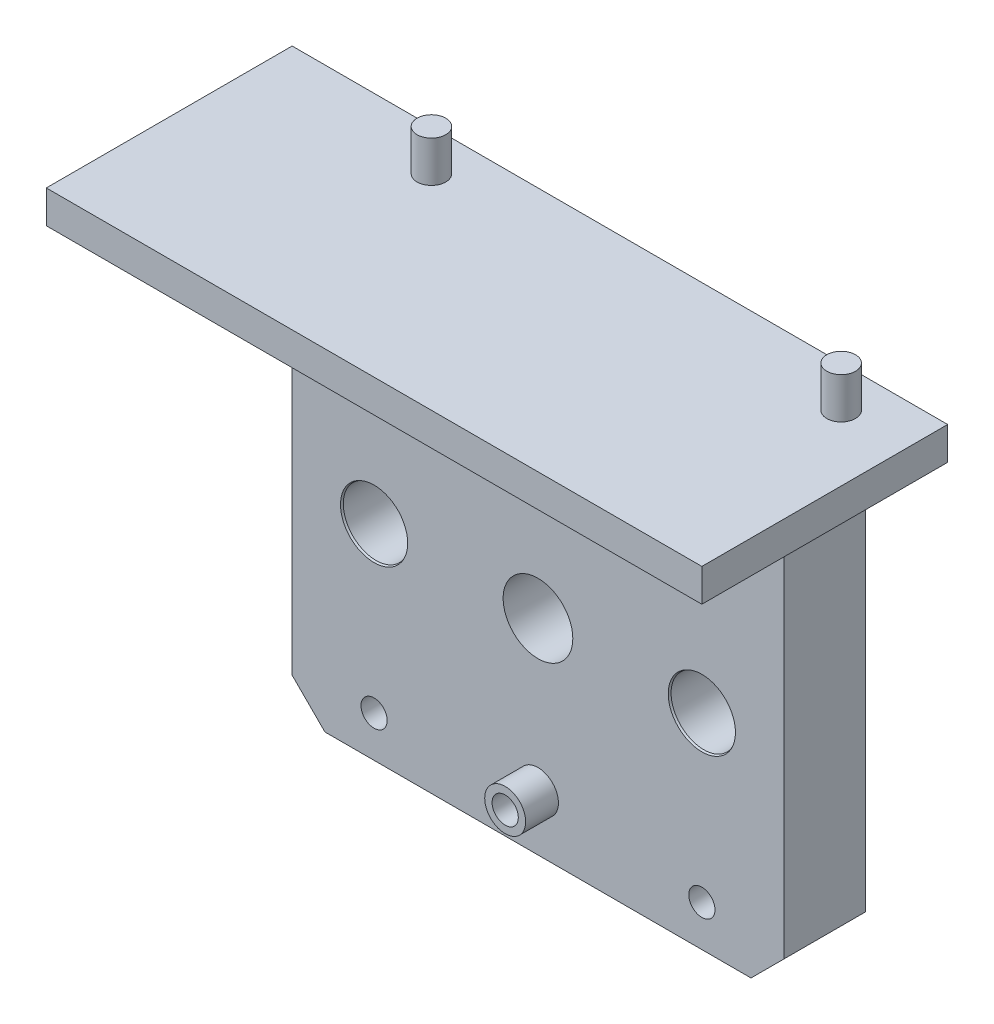
ISO-10303-21;
HEADER;
FILE_DESCRIPTION(('STEP AP214'),'2;1');
FILE_NAME('part.step','',(''),(''),'','','');
FILE_SCHEMA(('AUTOMOTIVE_DESIGN { 1 0 10303 214 1 1 1 1 }'));
ENDSEC;
DATA;
#1=APPLICATION_CONTEXT('core data for automotive mechanical design processes');
#2=APPLICATION_PROTOCOL_DEFINITION('international standard','automotive_design',2000,#1);
#3=PRODUCT_CONTEXT('',#1,'mechanical');
#4=PRODUCT('Part','Part','',(#3));
#5=PRODUCT_RELATED_PRODUCT_CATEGORY('part','',(#4));
#6=PRODUCT_DEFINITION_FORMATION('','',#4);
#7=PRODUCT_DEFINITION_CONTEXT('part definition',#1,'design');
#8=PRODUCT_DEFINITION('design','',#6,#7);
#9=PRODUCT_DEFINITION_SHAPE('','',#8);
#10=(LENGTH_UNIT() NAMED_UNIT(*) SI_UNIT(.MILLI.,.METRE.));
#11=(NAMED_UNIT(*) PLANE_ANGLE_UNIT() SI_UNIT($,.RADIAN.));
#12=(NAMED_UNIT(*) SI_UNIT($,.STERADIAN.) SOLID_ANGLE_UNIT());
#13=UNCERTAINTY_MEASURE_WITH_UNIT(LENGTH_MEASURE(1.E-05),#10,'distance_accuracy_value','');
#14=(GEOMETRIC_REPRESENTATION_CONTEXT(3) GLOBAL_UNCERTAINTY_ASSIGNED_CONTEXT((#13)) GLOBAL_UNIT_ASSIGNED_CONTEXT((#10,
#11,#12)) REPRESENTATION_CONTEXT('',''));
#15=CARTESIAN_POINT('',(0.,0.,0.));
#16=DIRECTION('',(0.,0.,1.));
#17=DIRECTION('',(1.,0.,0.));
#18=AXIS2_PLACEMENT_3D('',#15,#16,#17);
#19=CARTESIAN_POINT('',(0.,0.,10.));
#20=DIRECTION('',(0.,0.,-1.));
#21=DIRECTION('',(-1.,0.,0.));
#22=AXIS2_PLACEMENT_3D('',#19,#20,#21);
#23=PLANE('',#22);
#24=CARTESIAN_POINT('',(20.,-20.0000000000002,10.));
#25=DIRECTION('',(0.,0.,1.));
#26=DIRECTION('',(1.,0.,0.));
#27=AXIS2_PLACEMENT_3D('',#24,#25,#26);
#28=CIRCLE('',#27,1.6);
#29=CARTESIAN_POINT('',(21.6,-20.0000000000002,10.));
#30=VERTEX_POINT('',#29);
#31=EDGE_CURVE('E179',#30,#30,#28,.T.);
#32=ORIENTED_EDGE('',*,*,#31,.F.);
#33=EDGE_LOOP('',(#32));
#34=FACE_BOUND('',#33,.T.);
#35=CARTESIAN_POINT('',(-20.,20.0000000000002,10.));
#36=DIRECTION('',(0.,0.,1.));
#37=DIRECTION('',(1.,0.,0.));
#38=AXIS2_PLACEMENT_3D('',#35,#36,#37);
#39=CIRCLE('',#38,1.6);
#40=CARTESIAN_POINT('',(-18.4,20.0000000000002,10.));
#41=VERTEX_POINT('',#40);
#42=EDGE_CURVE('E175',#41,#41,#39,.T.);
#43=ORIENTED_EDGE('',*,*,#42,.F.);
#44=EDGE_LOOP('',(#43));
#45=FACE_BOUND('',#44,.T.);
#46=CARTESIAN_POINT('',(0.,-18.25,10.));
#47=DIRECTION('',(0.,0.,-1.));
#48=DIRECTION('',(-1.,0.,0.));
#49=AXIS2_PLACEMENT_3D('',#46,#47,#48);
#50=CIRCLE('',#49,2.5);
#51=CARTESIAN_POINT('',(-2.5,-18.25,10.));
#52=VERTEX_POINT('',#51);
#53=EDGE_CURVE('E253',#52,#52,#50,.F.);
#54=ORIENTED_EDGE('',*,*,#53,.F.);
#55=EDGE_LOOP('',(#54));
#56=FACE_BOUND('',#55,.T.);
#57=CARTESIAN_POINT('',(0.,18.25,10.));
#58=DIRECTION('',(0.,0.,-1.));
#59=DIRECTION('',(-1.,0.,0.));
#60=AXIS2_PLACEMENT_3D('',#57,#58,#59);
#61=CIRCLE('',#60,2.5);
#62=CARTESIAN_POINT('',(-2.5,18.25,10.));
#63=VERTEX_POINT('',#62);
#64=EDGE_CURVE('E245',#63,#63,#61,.F.);
#65=ORIENTED_EDGE('',*,*,#64,.F.);
#66=EDGE_LOOP('',(#65));
#67=FACE_BOUND('',#66,.T.);
#68=CARTESIAN_POINT('',(20.,0.,10.));
#69=DIRECTION('',(0.,0.,1.));
#70=DIRECTION('',(1.,0.,0.));
#71=AXIS2_PLACEMENT_3D('',#68,#69,#70);
#72=CIRCLE('',#71,4.1);
#73=CARTESIAN_POINT('',(24.1,0.,10.));
#74=VERTEX_POINT('',#73);
#75=EDGE_CURVE('E213',#74,#74,#72,.T.);
#76=ORIENTED_EDGE('',*,*,#75,.F.);
#77=EDGE_LOOP('',(#76));
#78=FACE_BOUND('',#77,.T.);
#79=CARTESIAN_POINT('',(-20.,0.,10.));
#80=DIRECTION('',(0.,0.,1.));
#81=DIRECTION('',(1.,0.,0.));
#82=AXIS2_PLACEMENT_3D('',#79,#80,#81);
#83=CIRCLE('',#82,4.1);
#84=CARTESIAN_POINT('',(-15.9,0.,10.));
#85=VERTEX_POINT('',#84);
#86=EDGE_CURVE('E222',#85,#85,#83,.T.);
#87=ORIENTED_EDGE('',*,*,#86,.F.);
#88=EDGE_LOOP('',(#87));
#89=FACE_BOUND('',#88,.T.);
#90=CARTESIAN_POINT('',(0.,0.,10.));
#91=DIRECTION('',(0.,0.,1.));
#92=DIRECTION('',(1.,0.,0.));
#93=AXIS2_PLACEMENT_3D('',#90,#91,#92);
#94=CIRCLE('',#93,4.25000000000002);
#95=CARTESIAN_POINT('',(4.25000000000002,0.,10.));
#96=VERTEX_POINT('',#95);
#97=EDGE_CURVE('E231',#96,#96,#94,.T.);
#98=ORIENTED_EDGE('',*,*,#97,.F.);
#99=EDGE_LOOP('',(#98));
#100=FACE_BOUND('',#99,.T.);
#101=DIRECTION('',(0.,1.,0.));
#102=VECTOR('',#101,1.);
#103=CARTESIAN_POINT('',(30.,-25.,10.));
#104=LINE('',#103,#102);
#105=CARTESIAN_POINT('',(30.,-21.,10.));
#106=VERTEX_POINT('',#105);
#107=CARTESIAN_POINT('',(30.,31.5,10.));
#108=VERTEX_POINT('',#107);
#109=EDGE_CURVE('E238',#106,#108,#104,.T.);
#110=ORIENTED_EDGE('',*,*,#109,.T.);
#111=DIRECTION('',(-1.,0.,0.));
#112=VECTOR('',#111,1.);
#113=CARTESIAN_POINT('',(0.,31.5,10.));
#114=LINE('',#113,#112);
#115=CARTESIAN_POINT('',(-30.,31.5,10.));
#116=VERTEX_POINT('',#115);
#117=EDGE_CURVE('E160',#108,#116,#114,.T.);
#118=ORIENTED_EDGE('',*,*,#117,.T.);
#119=DIRECTION('',(0.,-1.,0.));
#120=VECTOR('',#119,1.);
#121=CARTESIAN_POINT('',(-30.,-25.,10.));
#122=LINE('',#121,#120);
#123=CARTESIAN_POINT('',(-30.,-21.,10.));
#124=VERTEX_POINT('',#123);
#125=EDGE_CURVE('E52',#116,#124,#122,.T.);
#126=ORIENTED_EDGE('',*,*,#125,.T.);
#127=DIRECTION('',(-0.707106781186546,0.707106781186549,0.));
#128=VECTOR('',#127,1.);
#129=CARTESIAN_POINT('',(-26.,-25.,10.));
#130=LINE('',#129,#128);
#131=CARTESIAN_POINT('',(-26.,-25.,10.));
#132=VERTEX_POINT('',#131);
#133=EDGE_CURVE('E268',#124,#132,#130,.F.);
#134=ORIENTED_EDGE('',*,*,#133,.T.);
#135=DIRECTION('',(1.,0.,0.));
#136=VECTOR('',#135,1.);
#137=CARTESIAN_POINT('',(-30.,-25.,10.));
#138=LINE('',#137,#136);
#139=CARTESIAN_POINT('',(26.,-25.,10.));
#140=VERTEX_POINT('',#139);
#141=EDGE_CURVE('E243',#132,#140,#138,.T.);
#142=ORIENTED_EDGE('',*,*,#141,.T.);
#143=DIRECTION('',(-0.707106781186549,-0.707106781186546,0.));
#144=VECTOR('',#143,1.);
#145=CARTESIAN_POINT('',(30.,-21.,10.));
#146=LINE('',#145,#144);
#147=EDGE_CURVE('E270',#140,#106,#146,.F.);
#148=ORIENTED_EDGE('',*,*,#147,.T.);
#149=EDGE_LOOP('',(#110,#118,#126,#134,#142,#148));
#150=FACE_BOUND('',#149,.T.);
#151=CARTESIAN_POINT('',(20.,20.0000000000002,10.));
#152=DIRECTION('',(0.,0.,1.));
#153=DIRECTION('',(1.,0.,0.));
#154=AXIS2_PLACEMENT_3D('',#151,#152,#153);
#155=CIRCLE('',#154,1.6);
#156=CARTESIAN_POINT('',(21.6,20.0000000000002,10.));
#157=VERTEX_POINT('',#156);
#158=EDGE_CURVE('E172',#157,#157,#155,.F.);
#159=ORIENTED_EDGE('',*,*,#158,.T.);
#160=EDGE_LOOP('',(#159));
#161=FACE_BOUND('',#160,.T.);
#162=CARTESIAN_POINT('',(-20.,-20.0000000000002,10.));
#163=DIRECTION('',(0.,0.,-1.));
#164=DIRECTION('',(-1.,0.,0.));
#165=AXIS2_PLACEMENT_3D('',#162,#163,#164);
#166=CIRCLE('',#165,1.6);
#167=CARTESIAN_POINT('',(-21.6,-20.0000000000002,10.));
#168=VERTEX_POINT('',#167);
#169=EDGE_CURVE('E185',#168,#168,#166,.T.);
#170=ORIENTED_EDGE('',*,*,#169,.T.);
#171=EDGE_LOOP('',(#170));
#172=FACE_BOUND('',#171,.T.);
#173=ADVANCED_FACE('F36',(#34,#45,#56,#67,#78,#89,#100,#150,#161,#172),#23,.F.);
#174=CARTESIAN_POINT('',(0.,0.,0.));
#175=DIRECTION('',(0.,0.,-1.));
#176=DIRECTION('',(-1.,0.,0.));
#177=AXIS2_PLACEMENT_3D('',#174,#175,#176);
#178=PLANE('',#177);
#179=DIRECTION('',(0.,-1.,0.));
#180=VECTOR('',#179,1.);
#181=CARTESIAN_POINT('',(-30.,-25.,0.));
#182=LINE('',#181,#180);
#183=CARTESIAN_POINT('',(-30.,31.5,0.));
#184=VERTEX_POINT('',#183);
#185=CARTESIAN_POINT('',(-30.,-21.,0.));
#186=VERTEX_POINT('',#185);
#187=EDGE_CURVE('E248',#184,#186,#182,.T.);
#188=ORIENTED_EDGE('',*,*,#187,.F.);
#189=DIRECTION('',(-1.,0.,0.));
#190=VECTOR('',#189,1.);
#191=CARTESIAN_POINT('',(40.,31.5,0.));
#192=LINE('',#191,#190);
#193=CARTESIAN_POINT('',(-40.,31.5,0.));
#194=VERTEX_POINT('',#193);
#195=EDGE_CURVE('E152',#184,#194,#192,.T.);
#196=ORIENTED_EDGE('',*,*,#195,.T.);
#197=DIRECTION('',(0.,1.,0.));
#198=VECTOR('',#197,1.);
#199=CARTESIAN_POINT('',(-40.,31.5,0.));
#200=LINE('',#199,#198);
#201=CARTESIAN_POINT('',(-40.,35.5,0.));
#202=VERTEX_POINT('',#201);
#203=EDGE_CURVE('E142',#194,#202,#200,.T.);
#204=ORIENTED_EDGE('',*,*,#203,.T.);
#205=DIRECTION('',(-1.,0.,0.));
#206=VECTOR('',#205,1.);
#207=CARTESIAN_POINT('',(30.,35.5,0.));
#208=LINE('',#207,#206);
#209=CARTESIAN_POINT('',(40.,35.5,0.));
#210=VERTEX_POINT('',#209);
#211=EDGE_CURVE('E169',#210,#202,#208,.T.);
#212=ORIENTED_EDGE('',*,*,#211,.F.);
#213=DIRECTION('',(0.,1.,0.));
#214=VECTOR('',#213,1.);
#215=CARTESIAN_POINT('',(40.,31.5,0.));
#216=LINE('',#215,#214);
#217=CARTESIAN_POINT('',(40.,31.5,0.));
#218=VERTEX_POINT('',#217);
#219=EDGE_CURVE('E161',#218,#210,#216,.T.);
#220=ORIENTED_EDGE('',*,*,#219,.F.);
#221=CARTESIAN_POINT('',(30.,31.5,0.));
#222=VERTEX_POINT('',#221);
#223=EDGE_CURVE('E128',#218,#222,#192,.T.);
#224=ORIENTED_EDGE('',*,*,#223,.T.);
#225=DIRECTION('',(0.,1.,0.));
#226=VECTOR('',#225,1.);
#227=CARTESIAN_POINT('',(30.,-25.,0.));
#228=LINE('',#227,#226);
#229=CARTESIAN_POINT('',(30.,-21.,0.));
#230=VERTEX_POINT('',#229);
#231=EDGE_CURVE('E237',#230,#222,#228,.T.);
#232=ORIENTED_EDGE('',*,*,#231,.F.);
#233=DIRECTION('',(0.707106781186549,0.707106781186546,0.));
#234=VECTOR('',#233,1.);
#235=CARTESIAN_POINT('',(25.4999999999999,-25.5,0.));
#236=LINE('',#235,#234);
#237=CARTESIAN_POINT('',(26.,-25.,0.));
#238=VERTEX_POINT('',#237);
#239=EDGE_CURVE('E262',#230,#238,#236,.F.);
#240=ORIENTED_EDGE('',*,*,#239,.T.);
#241=DIRECTION('',(1.,0.,0.));
#242=VECTOR('',#241,1.);
#243=CARTESIAN_POINT('',(-30.,-25.,0.));
#244=LINE('',#243,#242);
#245=CARTESIAN_POINT('',(-26.,-25.,0.));
#246=VERTEX_POINT('',#245);
#247=EDGE_CURVE('E241',#246,#238,#244,.T.);
#248=ORIENTED_EDGE('',*,*,#247,.F.);
#249=DIRECTION('',(0.707106781186546,-0.707106781186549,0.));
#250=VECTOR('',#249,1.);
#251=CARTESIAN_POINT('',(-25.5000000000001,-25.5,0.));
#252=LINE('',#251,#250);
#253=EDGE_CURVE('E259',#246,#186,#252,.F.);
#254=ORIENTED_EDGE('',*,*,#253,.T.);
#255=EDGE_LOOP('',(#188,#196,#204,#212,#220,#224,#232,#240,#248,#254));
#256=FACE_BOUND('',#255,.T.);
#257=CARTESIAN_POINT('',(20.,20.0000000000002,0.));
#258=DIRECTION('',(0.,0.,1.));
#259=DIRECTION('',(1.,0.,0.));
#260=AXIS2_PLACEMENT_3D('',#257,#258,#259);
#261=CIRCLE('',#260,1.6);
#262=CARTESIAN_POINT('',(21.6,20.0000000000002,0.));
#263=VERTEX_POINT('',#262);
#264=EDGE_CURVE('E176',#263,#263,#261,.F.);
#265=ORIENTED_EDGE('',*,*,#264,.F.);
#266=EDGE_LOOP('',(#265));
#267=FACE_BOUND('',#266,.T.);
#268=CARTESIAN_POINT('',(-20.,20.0000000000002,0.));
#269=DIRECTION('',(0.,0.,1.));
#270=DIRECTION('',(1.,0.,0.));
#271=AXIS2_PLACEMENT_3D('',#268,#269,#270);
#272=CIRCLE('',#271,1.6);
#273=CARTESIAN_POINT('',(-18.4,20.0000000000002,0.));
#274=VERTEX_POINT('',#273);
#275=EDGE_CURVE('E190',#274,#274,#272,.T.);
#276=ORIENTED_EDGE('',*,*,#275,.T.);
#277=EDGE_LOOP('',(#276));
#278=FACE_BOUND('',#277,.T.);
#279=CARTESIAN_POINT('',(0.,18.25,0.));
#280=DIRECTION('',(0.,0.,1.));
#281=DIRECTION('',(1.,0.,0.));
#282=AXIS2_PLACEMENT_3D('',#279,#280,#281);
#283=CIRCLE('',#282,1.60000000000001);
#284=CARTESIAN_POINT('',(1.60000000000001,18.25,0.));
#285=VERTEX_POINT('',#284);
#286=EDGE_CURVE('E198',#285,#285,#283,.T.);
#287=ORIENTED_EDGE('',*,*,#286,.T.);
#288=EDGE_LOOP('',(#287));
#289=FACE_BOUND('',#288,.T.);
#290=CARTESIAN_POINT('',(0.,-18.25,0.));
#291=DIRECTION('',(0.,0.,1.));
#292=DIRECTION('',(1.,0.,0.));
#293=AXIS2_PLACEMENT_3D('',#290,#291,#292);
#294=CIRCLE('',#293,1.60000000000001);
#295=CARTESIAN_POINT('',(1.60000000000001,-18.25,0.));
#296=VERTEX_POINT('',#295);
#297=EDGE_CURVE('E204',#296,#296,#294,.T.);
#298=ORIENTED_EDGE('',*,*,#297,.T.);
#299=EDGE_LOOP('',(#298));
#300=FACE_BOUND('',#299,.T.);
#301=CARTESIAN_POINT('',(20.,0.,0.));
#302=DIRECTION('',(0.,0.,1.));
#303=DIRECTION('',(1.,0.,0.));
#304=AXIS2_PLACEMENT_3D('',#301,#302,#303);
#305=CIRCLE('',#304,4.);
#306=CARTESIAN_POINT('',(24.,0.,0.));
#307=VERTEX_POINT('',#306);
#308=EDGE_CURVE('E219',#307,#307,#305,.T.);
#309=ORIENTED_EDGE('',*,*,#308,.T.);
#310=EDGE_LOOP('',(#309));
#311=FACE_BOUND('',#310,.T.);
#312=CARTESIAN_POINT('',(-20.,0.,0.));
#313=DIRECTION('',(0.,0.,1.));
#314=DIRECTION('',(1.,0.,0.));
#315=AXIS2_PLACEMENT_3D('',#312,#313,#314);
#316=CIRCLE('',#315,4.);
#317=CARTESIAN_POINT('',(-16.,0.,0.));
#318=VERTEX_POINT('',#317);
#319=EDGE_CURVE('E228',#318,#318,#316,.T.);
#320=ORIENTED_EDGE('',*,*,#319,.T.);
#321=EDGE_LOOP('',(#320));
#322=FACE_BOUND('',#321,.T.);
#323=CARTESIAN_POINT('',(0.,0.,0.));
#324=DIRECTION('',(0.,0.,-1.));
#325=DIRECTION('',(-1.,0.,0.));
#326=AXIS2_PLACEMENT_3D('',#323,#324,#325);
#327=CIRCLE('',#326,4.25000000000001);
#328=CARTESIAN_POINT('',(-4.25000000000001,0.,0.));
#329=VERTEX_POINT('',#328);
#330=EDGE_CURVE('E234',#329,#329,#327,.T.);
#331=ORIENTED_EDGE('',*,*,#330,.F.);
#332=EDGE_LOOP('',(#331));
#333=FACE_BOUND('',#332,.T.);
#334=CARTESIAN_POINT('',(20.,-20.0000000000002,0.));
#335=DIRECTION('',(0.,0.,1.));
#336=DIRECTION('',(1.,0.,0.));
#337=AXIS2_PLACEMENT_3D('',#334,#335,#336);
#338=CIRCLE('',#337,1.6);
#339=CARTESIAN_POINT('',(21.6,-20.0000000000002,0.));
#340=VERTEX_POINT('',#339);
#341=EDGE_CURVE('E182',#340,#340,#338,.T.);
#342=ORIENTED_EDGE('',*,*,#341,.T.);
#343=EDGE_LOOP('',(#342));
#344=FACE_BOUND('',#343,.T.);
#345=CARTESIAN_POINT('',(-20.,-20.0000000000002,0.));
#346=DIRECTION('',(0.,0.,-1.));
#347=DIRECTION('',(-1.,0.,0.));
#348=AXIS2_PLACEMENT_3D('',#345,#346,#347);
#349=CIRCLE('',#348,1.6);
#350=CARTESIAN_POINT('',(-21.6,-20.0000000000002,0.));
#351=VERTEX_POINT('',#350);
#352=EDGE_CURVE('E171',#351,#351,#349,.T.);
#353=ORIENTED_EDGE('',*,*,#352,.F.);
#354=EDGE_LOOP('',(#353));
#355=FACE_BOUND('',#354,.T.);
#356=ADVANCED_FACE('F283',(#256,#267,#278,#289,#300,#311,#322,#333,#344,#355),#178,.T.);
#357=CARTESIAN_POINT('',(30.,-25.,10.));
#358=DIRECTION('',(-1.,0.,0.));
#359=DIRECTION('',(0.,0.,1.));
#360=AXIS2_PLACEMENT_3D('',#357,#358,#359);
#361=PLANE('',#360);
#362=ORIENTED_EDGE('',*,*,#231,.T.);
#363=DIRECTION('',(0.,0.,1.));
#364=VECTOR('',#363,1.);
#365=CARTESIAN_POINT('',(30.,31.5,10.));
#366=LINE('',#365,#364);
#367=EDGE_CURVE('E166',#222,#108,#366,.T.);
#368=ORIENTED_EDGE('',*,*,#367,.T.);
#369=ORIENTED_EDGE('',*,*,#109,.F.);
#370=DIRECTION('',(0.,0.,-1.));
#371=VECTOR('',#370,1.);
#372=CARTESIAN_POINT('',(30.,-21.,10.));
#373=LINE('',#372,#371);
#374=EDGE_CURVE('E256',#106,#230,#373,.T.);
#375=ORIENTED_EDGE('',*,*,#374,.T.);
#376=EDGE_LOOP('',(#362,#368,#369,#375));
#377=FACE_BOUND('',#376,.T.);
#378=ADVANCED_FACE('F291',(#377),#361,.F.);
#379=CARTESIAN_POINT('',(-30.,-25.,10.));
#380=DIRECTION('',(1.,0.,0.));
#381=DIRECTION('',(0.,0.,-1.));
#382=AXIS2_PLACEMENT_3D('',#379,#380,#381);
#383=PLANE('',#382);
#384=ORIENTED_EDGE('',*,*,#125,.F.);
#385=DIRECTION('',(0.,0.,-1.));
#386=VECTOR('',#385,1.);
#387=CARTESIAN_POINT('',(-30.,31.5,10.));
#388=LINE('',#387,#386);
#389=EDGE_CURVE('E11',#116,#184,#388,.T.);
#390=ORIENTED_EDGE('',*,*,#389,.T.);
#391=ORIENTED_EDGE('',*,*,#187,.T.);
#392=DIRECTION('',(0.,0.,1.));
#393=VECTOR('',#392,1.);
#394=CARTESIAN_POINT('',(-30.,-21.,10.));
#395=LINE('',#394,#393);
#396=EDGE_CURVE('E45',#186,#124,#395,.T.);
#397=ORIENTED_EDGE('',*,*,#396,.T.);
#398=EDGE_LOOP('',(#384,#390,#391,#397));
#399=FACE_BOUND('',#398,.T.);
#400=ADVANCED_FACE('F274',(#399),#383,.F.);
#401=CARTESIAN_POINT('',(-30.,-25.,10.));
#402=DIRECTION('',(0.,1.,0.));
#403=DIRECTION('',(0.,0.,1.));
#404=AXIS2_PLACEMENT_3D('',#401,#402,#403);
#405=PLANE('',#404);
#406=ORIENTED_EDGE('',*,*,#247,.T.);
#407=DIRECTION('',(0.,0.,1.));
#408=VECTOR('',#407,1.);
#409=CARTESIAN_POINT('',(26.,-25.,10.));
#410=LINE('',#409,#408);
#411=EDGE_CURVE('E60',#238,#140,#410,.T.);
#412=ORIENTED_EDGE('',*,*,#411,.T.);
#413=ORIENTED_EDGE('',*,*,#141,.F.);
#414=DIRECTION('',(0.,0.,-1.));
#415=VECTOR('',#414,1.);
#416=CARTESIAN_POINT('',(-26.,-25.,10.));
#417=LINE('',#416,#415);
#418=EDGE_CURVE('E264',#132,#246,#417,.T.);
#419=ORIENTED_EDGE('',*,*,#418,.T.);
#420=EDGE_LOOP('',(#406,#412,#413,#419));
#421=FACE_BOUND('',#420,.T.);
#422=ADVANCED_FACE('F280',(#421),#405,.F.);
#423=CARTESIAN_POINT('',(0.,0.,10.));
#424=DIRECTION('',(0.,0.,1.));
#425=DIRECTION('',(1.,0.,0.));
#426=AXIS2_PLACEMENT_3D('',#423,#424,#425);
#427=CYLINDRICAL_SURFACE('',#426,4.25000000000001);
#428=ORIENTED_EDGE('',*,*,#330,.T.);
#429=EDGE_LOOP('',(#428));
#430=FACE_BOUND('',#429,.T.);
#431=ORIENTED_EDGE('',*,*,#97,.T.);
#432=EDGE_LOOP('',(#431));
#433=FACE_BOUND('',#432,.T.);
#434=ADVANCED_FACE('F317',(#430,#433),#427,.F.);
#435=CARTESIAN_POINT('',(-20.,0.,10.));
#436=DIRECTION('',(0.,0.,1.));
#437=DIRECTION('',(1.,0.,0.));
#438=AXIS2_PLACEMENT_3D('',#435,#436,#437);
#439=CYLINDRICAL_SURFACE('',#438,4.00000000000001);
#440=ORIENTED_EDGE('',*,*,#319,.F.);
#441=EDGE_LOOP('',(#440));
#442=FACE_BOUND('',#441,.T.);
#443=CARTESIAN_POINT('',(-20.,0.,9.75857864376273));
#444=DIRECTION('',(0.,0.,1.));
#445=DIRECTION('',(1.,0.,0.));
#446=AXIS2_PLACEMENT_3D('',#443,#444,#445);
#447=CIRCLE('',#446,4.00000000000001);
#448=CARTESIAN_POINT('',(-16.,0.,9.75857864376273));
#449=VERTEX_POINT('',#448);
#450=EDGE_CURVE('E225',#449,#449,#447,.T.);
#451=ORIENTED_EDGE('',*,*,#450,.T.);
#452=EDGE_LOOP('',(#451));
#453=FACE_BOUND('',#452,.T.);
#454=ADVANCED_FACE('F374',(#442,#453),#439,.F.);
#455=CARTESIAN_POINT('',(-20.,0.,10.));
#456=DIRECTION('',(0.,0.,1.));
#457=DIRECTION('',(1.,0.,0.));
#458=AXIS2_PLACEMENT_3D('',#455,#456,#457);
#459=CONICAL_SURFACE('',#458,4.1,0.392699081698732);
#460=ORIENTED_EDGE('',*,*,#450,.F.);
#461=EDGE_LOOP('',(#460));
#462=FACE_BOUND('',#461,.T.);
#463=ORIENTED_EDGE('',*,*,#86,.T.);
#464=EDGE_LOOP('',(#463));
#465=FACE_BOUND('',#464,.T.);
#466=ADVANCED_FACE('F371',(#462,#465),#459,.F.);
#467=CARTESIAN_POINT('',(20.,0.,10.));
#468=DIRECTION('',(0.,0.,1.));
#469=DIRECTION('',(1.,0.,0.));
#470=AXIS2_PLACEMENT_3D('',#467,#468,#469);
#471=CYLINDRICAL_SURFACE('',#470,4.00000000000001);
#472=ORIENTED_EDGE('',*,*,#308,.F.);
#473=EDGE_LOOP('',(#472));
#474=FACE_BOUND('',#473,.T.);
#475=CARTESIAN_POINT('',(20.,0.,9.75857864376273));
#476=DIRECTION('',(0.,0.,1.));
#477=DIRECTION('',(1.,0.,0.));
#478=AXIS2_PLACEMENT_3D('',#475,#476,#477);
#479=CIRCLE('',#478,4.00000000000001);
#480=CARTESIAN_POINT('',(24.,0.,9.75857864376273));
#481=VERTEX_POINT('',#480);
#482=EDGE_CURVE('E216',#481,#481,#479,.T.);
#483=ORIENTED_EDGE('',*,*,#482,.T.);
#484=EDGE_LOOP('',(#483));
#485=FACE_BOUND('',#484,.T.);
#486=ADVANCED_FACE('F367',(#474,#485),#471,.F.);
#487=CARTESIAN_POINT('',(20.,0.,10.));
#488=DIRECTION('',(0.,0.,1.));
#489=DIRECTION('',(1.,0.,0.));
#490=AXIS2_PLACEMENT_3D('',#487,#488,#489);
#491=CONICAL_SURFACE('',#490,4.1,0.392699081698732);
#492=ORIENTED_EDGE('',*,*,#482,.F.);
#493=EDGE_LOOP('',(#492));
#494=FACE_BOUND('',#493,.T.);
#495=ORIENTED_EDGE('',*,*,#75,.T.);
#496=EDGE_LOOP('',(#495));
#497=FACE_BOUND('',#496,.T.);
#498=ADVANCED_FACE('F363',(#494,#497),#491,.F.);
#499=CARTESIAN_POINT('',(0.,18.25,14.));
#500=DIRECTION('',(0.,0.,-1.));
#501=DIRECTION('',(-1.,0.,0.));
#502=AXIS2_PLACEMENT_3D('',#499,#500,#501);
#503=CYLINDRICAL_SURFACE('',#502,2.5);
#504=CARTESIAN_POINT('',(0.,18.25,14.));
#505=DIRECTION('',(0.,0.,1.));
#506=DIRECTION('',(1.,0.,0.));
#507=AXIS2_PLACEMENT_3D('',#504,#505,#506);
#508=CIRCLE('',#507,2.5);
#509=CARTESIAN_POINT('',(2.5,18.25,14.));
#510=VERTEX_POINT('',#509);
#511=EDGE_CURVE('E210',#510,#510,#508,.T.);
#512=ORIENTED_EDGE('',*,*,#511,.F.);
#513=EDGE_LOOP('',(#512));
#514=FACE_BOUND('',#513,.T.);
#515=ORIENTED_EDGE('',*,*,#64,.T.);
#516=EDGE_LOOP('',(#515));
#517=FACE_BOUND('',#516,.T.);
#518=ADVANCED_FACE('F359',(#514,#517),#503,.T.);
#519=CARTESIAN_POINT('',(0.,18.25,14.));
#520=DIRECTION('',(0.,0.,1.));
#521=DIRECTION('',(1.,0.,0.));
#522=AXIS2_PLACEMENT_3D('',#519,#520,#521);
#523=PLANE('',#522);
#524=CARTESIAN_POINT('',(0.,18.25,14.));
#525=DIRECTION('',(0.,0.,1.));
#526=DIRECTION('',(1.,0.,0.));
#527=AXIS2_PLACEMENT_3D('',#524,#525,#526);
#528=CIRCLE('',#527,1.60000000000001);
#529=CARTESIAN_POINT('',(1.60000000000001,18.25,14.));
#530=VERTEX_POINT('',#529);
#531=EDGE_CURVE('E193',#530,#530,#528,.T.);
#532=ORIENTED_EDGE('',*,*,#531,.F.);
#533=EDGE_LOOP('',(#532));
#534=FACE_BOUND('',#533,.T.);
#535=ORIENTED_EDGE('',*,*,#511,.T.);
#536=EDGE_LOOP('',(#535));
#537=FACE_BOUND('',#536,.T.);
#538=ADVANCED_FACE('F355',(#534,#537),#523,.T.);
#539=CARTESIAN_POINT('',(0.,-18.25,14.));
#540=DIRECTION('',(0.,0.,-1.));
#541=DIRECTION('',(-1.,0.,0.));
#542=AXIS2_PLACEMENT_3D('',#539,#540,#541);
#543=CYLINDRICAL_SURFACE('',#542,2.5);
#544=CARTESIAN_POINT('',(0.,-18.25,14.));
#545=DIRECTION('',(0.,0.,1.));
#546=DIRECTION('',(1.,0.,0.));
#547=AXIS2_PLACEMENT_3D('',#544,#545,#546);
#548=CIRCLE('',#547,2.5);
#549=CARTESIAN_POINT('',(2.5,-18.25,14.));
#550=VERTEX_POINT('',#549);
#551=EDGE_CURVE('E207',#550,#550,#548,.T.);
#552=ORIENTED_EDGE('',*,*,#551,.F.);
#553=EDGE_LOOP('',(#552));
#554=FACE_BOUND('',#553,.T.);
#555=ORIENTED_EDGE('',*,*,#53,.T.);
#556=EDGE_LOOP('',(#555));
#557=FACE_BOUND('',#556,.T.);
#558=ADVANCED_FACE('F351',(#554,#557),#543,.T.);
#559=CARTESIAN_POINT('',(0.,-18.25,14.));
#560=DIRECTION('',(0.,0.,1.));
#561=DIRECTION('',(1.,0.,0.));
#562=AXIS2_PLACEMENT_3D('',#559,#560,#561);
#563=PLANE('',#562);
#564=CARTESIAN_POINT('',(0.,-18.25,14.));
#565=DIRECTION('',(0.,0.,1.));
#566=DIRECTION('',(1.,0.,0.));
#567=AXIS2_PLACEMENT_3D('',#564,#565,#566);
#568=CIRCLE('',#567,1.60000000000001);
#569=CARTESIAN_POINT('',(1.60000000000001,-18.25,14.));
#570=VERTEX_POINT('',#569);
#571=EDGE_CURVE('E201',#570,#570,#568,.T.);
#572=ORIENTED_EDGE('',*,*,#571,.F.);
#573=EDGE_LOOP('',(#572));
#574=FACE_BOUND('',#573,.T.);
#575=ORIENTED_EDGE('',*,*,#551,.T.);
#576=EDGE_LOOP('',(#575));
#577=FACE_BOUND('',#576,.T.);
#578=ADVANCED_FACE('F341',(#574,#577),#563,.T.);
#579=CARTESIAN_POINT('',(0.,-18.25,14.));
#580=DIRECTION('',(0.,0.,1.));
#581=DIRECTION('',(1.,0.,0.));
#582=AXIS2_PLACEMENT_3D('',#579,#580,#581);
#583=CYLINDRICAL_SURFACE('',#582,1.60000000000001);
#584=ORIENTED_EDGE('',*,*,#297,.F.);
#585=EDGE_LOOP('',(#584));
#586=FACE_BOUND('',#585,.T.);
#587=ORIENTED_EDGE('',*,*,#571,.T.);
#588=EDGE_LOOP('',(#587));
#589=FACE_BOUND('',#588,.T.);
#590=ADVANCED_FACE('F335',(#586,#589),#583,.F.);
#591=CARTESIAN_POINT('',(0.,18.25,14.));
#592=DIRECTION('',(0.,0.,1.));
#593=DIRECTION('',(1.,0.,0.));
#594=AXIS2_PLACEMENT_3D('',#591,#592,#593);
#595=CYLINDRICAL_SURFACE('',#594,1.60000000000001);
#596=ORIENTED_EDGE('',*,*,#286,.F.);
#597=EDGE_LOOP('',(#596));
#598=FACE_BOUND('',#597,.T.);
#599=ORIENTED_EDGE('',*,*,#531,.T.);
#600=EDGE_LOOP('',(#599));
#601=FACE_BOUND('',#600,.T.);
#602=ADVANCED_FACE('F329',(#598,#601),#595,.F.);
#603=CARTESIAN_POINT('',(30.,-21.,10.));
#604=DIRECTION('',(-0.707106781186546,0.707106781186549,0.));
#605=DIRECTION('',(0.,0.,-1.));
#606=AXIS2_PLACEMENT_3D('',#603,#604,#605);
#607=PLANE('',#606);
#608=ORIENTED_EDGE('',*,*,#147,.F.);
#609=ORIENTED_EDGE('',*,*,#411,.F.);
#610=ORIENTED_EDGE('',*,*,#239,.F.);
#611=ORIENTED_EDGE('',*,*,#374,.F.);
#612=EDGE_LOOP('',(#608,#609,#610,#611));
#613=FACE_BOUND('',#612,.T.);
#614=ADVANCED_FACE('F288',(#613),#607,.F.);
#615=CARTESIAN_POINT('',(-26.,-25.,10.));
#616=DIRECTION('',(0.707106781186549,0.707106781186546,0.));
#617=DIRECTION('',(0.,0.,-1.));
#618=AXIS2_PLACEMENT_3D('',#615,#616,#617);
#619=PLANE('',#618);
#620=ORIENTED_EDGE('',*,*,#133,.F.);
#621=ORIENTED_EDGE('',*,*,#396,.F.);
#622=ORIENTED_EDGE('',*,*,#253,.F.);
#623=ORIENTED_EDGE('',*,*,#418,.F.);
#624=EDGE_LOOP('',(#620,#621,#622,#623));
#625=FACE_BOUND('',#624,.T.);
#626=ADVANCED_FACE('F39',(#625),#619,.F.);
#627=CARTESIAN_POINT('',(-20.,20.0000000000002,0.));
#628=DIRECTION('',(0.,0.,1.));
#629=DIRECTION('',(1.,0.,0.));
#630=AXIS2_PLACEMENT_3D('',#627,#628,#629);
#631=CYLINDRICAL_SURFACE('',#630,1.6);
#632=ORIENTED_EDGE('',*,*,#275,.F.);
#633=EDGE_LOOP('',(#632));
#634=FACE_BOUND('',#633,.T.);
#635=ORIENTED_EDGE('',*,*,#42,.T.);
#636=EDGE_LOOP('',(#635));
#637=FACE_BOUND('',#636,.T.);
#638=ADVANCED_FACE('F334',(#634,#637),#631,.F.);
#639=CARTESIAN_POINT('',(20.,20.0000000000002,0.));
#640=DIRECTION('',(0.,0.,1.));
#641=DIRECTION('',(1.,0.,0.));
#642=AXIS2_PLACEMENT_3D('',#639,#640,#641);
#643=CYLINDRICAL_SURFACE('',#642,1.6);
#644=ORIENTED_EDGE('',*,*,#264,.T.);
#645=EDGE_LOOP('',(#644));
#646=FACE_BOUND('',#645,.T.);
#647=ORIENTED_EDGE('',*,*,#158,.F.);
#648=EDGE_LOOP('',(#647));
#649=FACE_BOUND('',#648,.T.);
#650=ADVANCED_FACE('F411',(#646,#649),#643,.F.);
#651=CARTESIAN_POINT('',(20.,-20.0000000000002,0.));
#652=DIRECTION('',(0.,0.,1.));
#653=DIRECTION('',(1.,0.,0.));
#654=AXIS2_PLACEMENT_3D('',#651,#652,#653);
#655=CYLINDRICAL_SURFACE('',#654,1.6);
#656=ORIENTED_EDGE('',*,*,#341,.F.);
#657=EDGE_LOOP('',(#656));
#658=FACE_BOUND('',#657,.T.);
#659=ORIENTED_EDGE('',*,*,#31,.T.);
#660=EDGE_LOOP('',(#659));
#661=FACE_BOUND('',#660,.T.);
#662=ADVANCED_FACE('F402',(#658,#661),#655,.F.);
#663=CARTESIAN_POINT('',(-20.,-20.0000000000002,0.));
#664=DIRECTION('',(0.,0.,1.));
#665=DIRECTION('',(1.,0.,0.));
#666=AXIS2_PLACEMENT_3D('',#663,#664,#665);
#667=CYLINDRICAL_SURFACE('',#666,1.6);
#668=ORIENTED_EDGE('',*,*,#352,.T.);
#669=EDGE_LOOP('',(#668));
#670=FACE_BOUND('',#669,.T.);
#671=ORIENTED_EDGE('',*,*,#169,.F.);
#672=EDGE_LOOP('',(#671));
#673=FACE_BOUND('',#672,.T.);
#674=ADVANCED_FACE('F399',(#670,#673),#667,.F.);
#675=CARTESIAN_POINT('',(0.,35.5,0.));
#676=DIRECTION('',(0.,1.,0.));
#677=DIRECTION('',(0.,0.,1.));
#678=AXIS2_PLACEMENT_3D('',#675,#676,#677);
#679=PLANE('',#678);
#680=CARTESIAN_POINT('',(31.9999999999999,35.5,4.99999999999998));
#681=DIRECTION('',(0.,1.,0.));
#682=DIRECTION('',(0.,0.,1.));
#683=AXIS2_PLACEMENT_3D('',#680,#681,#682);
#684=CIRCLE('',#683,1.75);
#685=CARTESIAN_POINT('',(31.9999999999999,35.5,6.74999999999998));
#686=VERTEX_POINT('',#685);
#687=EDGE_CURVE('E654',#686,#686,#684,.T.);
#688=ORIENTED_EDGE('',*,*,#687,.F.);
#689=EDGE_LOOP('',(#688));
#690=FACE_BOUND('',#689,.T.);
#691=CARTESIAN_POINT('',(-18.0000000000002,35.5,4.99999999999999));
#692=DIRECTION('',(0.,1.,0.));
#693=DIRECTION('',(0.,0.,1.));
#694=AXIS2_PLACEMENT_3D('',#691,#692,#693);
#695=CIRCLE('',#694,1.75);
#696=CARTESIAN_POINT('',(-18.0000000000002,35.5,6.74999999999999));
#697=VERTEX_POINT('',#696);
#698=EDGE_CURVE('E148',#697,#697,#695,.T.);
#699=ORIENTED_EDGE('',*,*,#698,.F.);
#700=EDGE_LOOP('',(#699));
#701=FACE_BOUND('',#700,.T.);
#702=DIRECTION('',(0.,0.,-1.));
#703=VECTOR('',#702,1.);
#704=CARTESIAN_POINT('',(40.,35.5,0.));
#705=LINE('',#704,#703);
#706=CARTESIAN_POINT('',(40.,35.5,30.));
#707=VERTEX_POINT('',#706);
#708=EDGE_CURVE('E143',#707,#210,#705,.T.);
#709=ORIENTED_EDGE('',*,*,#708,.T.);
#710=ORIENTED_EDGE('',*,*,#211,.T.);
#711=DIRECTION('',(0.,0.,1.));
#712=VECTOR('',#711,1.);
#713=CARTESIAN_POINT('',(-40.,35.5,0.));
#714=LINE('',#713,#712);
#715=CARTESIAN_POINT('',(-40.,35.5,30.));
#716=VERTEX_POINT('',#715);
#717=EDGE_CURVE('E155',#202,#716,#714,.T.);
#718=ORIENTED_EDGE('',*,*,#717,.T.);
#719=DIRECTION('',(1.,0.,0.));
#720=VECTOR('',#719,1.);
#721=CARTESIAN_POINT('',(40.,35.5,30.));
#722=LINE('',#721,#720);
#723=EDGE_CURVE('E122',#716,#707,#722,.T.);
#724=ORIENTED_EDGE('',*,*,#723,.T.);
#725=EDGE_LOOP('',(#709,#710,#718,#724));
#726=FACE_BOUND('',#725,.T.);
#727=ADVANCED_FACE('F293',(#690,#701,#726),#679,.T.);
#728=CARTESIAN_POINT('',(0.,31.5,0.));
#729=DIRECTION('',(0.,-1.,0.));
#730=DIRECTION('',(0.,0.,-1.));
#731=AXIS2_PLACEMENT_3D('',#728,#729,#730);
#732=PLANE('',#731);
#733=ORIENTED_EDGE('',*,*,#367,.F.);
#734=ORIENTED_EDGE('',*,*,#223,.F.);
#735=DIRECTION('',(0.,0.,-1.));
#736=VECTOR('',#735,1.);
#737=CARTESIAN_POINT('',(40.,31.5,0.));
#738=LINE('',#737,#736);
#739=CARTESIAN_POINT('',(40.,31.5,30.));
#740=VERTEX_POINT('',#739);
#741=EDGE_CURVE('E137',#740,#218,#738,.T.);
#742=ORIENTED_EDGE('',*,*,#741,.F.);
#743=DIRECTION('',(1.,0.,0.));
#744=VECTOR('',#743,1.);
#745=CARTESIAN_POINT('',(40.,31.5,30.));
#746=LINE('',#745,#744);
#747=CARTESIAN_POINT('',(-40.,31.5,30.));
#748=VERTEX_POINT('',#747);
#749=EDGE_CURVE('E120',#748,#740,#746,.T.);
#750=ORIENTED_EDGE('',*,*,#749,.F.);
#751=DIRECTION('',(0.,0.,1.));
#752=VECTOR('',#751,1.);
#753=CARTESIAN_POINT('',(-40.,31.5,0.));
#754=LINE('',#753,#752);
#755=EDGE_CURVE('E134',#194,#748,#754,.T.);
#756=ORIENTED_EDGE('',*,*,#755,.F.);
#757=ORIENTED_EDGE('',*,*,#195,.F.);
#758=ORIENTED_EDGE('',*,*,#389,.F.);
#759=ORIENTED_EDGE('',*,*,#117,.F.);
#760=EDGE_LOOP('',(#733,#734,#742,#750,#756,#757,#758,#759));
#761=FACE_BOUND('',#760,.T.);
#762=ADVANCED_FACE('F133',(#761),#732,.T.);
#763=CARTESIAN_POINT('',(-40.,31.5,0.));
#764=DIRECTION('',(-1.,0.,0.));
#765=DIRECTION('',(0.,0.,1.));
#766=AXIS2_PLACEMENT_3D('',#763,#764,#765);
#767=PLANE('',#766);
#768=ORIENTED_EDGE('',*,*,#717,.F.);
#769=ORIENTED_EDGE('',*,*,#203,.F.);
#770=ORIENTED_EDGE('',*,*,#755,.T.);
#771=DIRECTION('',(0.,1.,0.));
#772=VECTOR('',#771,1.);
#773=CARTESIAN_POINT('',(-40.,31.5,30.));
#774=LINE('',#773,#772);
#775=EDGE_CURVE('E117',#748,#716,#774,.T.);
#776=ORIENTED_EDGE('',*,*,#775,.T.);
#777=EDGE_LOOP('',(#768,#769,#770,#776));
#778=FACE_BOUND('',#777,.T.);
#779=ADVANCED_FACE('F140',(#778),#767,.T.);
#780=CARTESIAN_POINT('',(40.,31.5,0.));
#781=DIRECTION('',(1.,0.,0.));
#782=DIRECTION('',(0.,0.,-1.));
#783=AXIS2_PLACEMENT_3D('',#780,#781,#782);
#784=PLANE('',#783);
#785=ORIENTED_EDGE('',*,*,#708,.F.);
#786=DIRECTION('',(0.,1.,0.));
#787=VECTOR('',#786,1.);
#788=CARTESIAN_POINT('',(40.,31.5,30.));
#789=LINE('',#788,#787);
#790=EDGE_CURVE('E127',#740,#707,#789,.T.);
#791=ORIENTED_EDGE('',*,*,#790,.F.);
#792=ORIENTED_EDGE('',*,*,#741,.T.);
#793=ORIENTED_EDGE('',*,*,#219,.T.);
#794=EDGE_LOOP('',(#785,#791,#792,#793));
#795=FACE_BOUND('',#794,.T.);
#796=ADVANCED_FACE('F296',(#795),#784,.T.);
#797=CARTESIAN_POINT('',(40.,31.5,30.));
#798=DIRECTION('',(0.,0.,1.));
#799=DIRECTION('',(1.,0.,0.));
#800=AXIS2_PLACEMENT_3D('',#797,#798,#799);
#801=PLANE('',#800);
#802=ORIENTED_EDGE('',*,*,#723,.F.);
#803=ORIENTED_EDGE('',*,*,#775,.F.);
#804=ORIENTED_EDGE('',*,*,#749,.T.);
#805=ORIENTED_EDGE('',*,*,#790,.T.);
#806=EDGE_LOOP('',(#802,#803,#804,#805));
#807=FACE_BOUND('',#806,.T.);
#808=ADVANCED_FACE('F119',(#807),#801,.T.);
#809=CARTESIAN_POINT('',(-18.0000000000002,40.5,4.99999999999999));
#810=DIRECTION('',(0.,-1.,0.));
#811=DIRECTION('',(0.,0.,-1.));
#812=AXIS2_PLACEMENT_3D('',#809,#810,#811);
#813=CYLINDRICAL_SURFACE('',#812,1.75);
#814=CARTESIAN_POINT('',(-18.0000000000002,40.5,4.99999999999999));
#815=DIRECTION('',(0.,1.,0.));
#816=DIRECTION('',(0.,0.,1.));
#817=AXIS2_PLACEMENT_3D('',#814,#815,#816);
#818=CIRCLE('',#817,1.75);
#819=CARTESIAN_POINT('',(-18.0000000000002,40.5,6.74999999999999));
#820=VERTEX_POINT('',#819);
#821=EDGE_CURVE('E157',#820,#820,#818,.T.);
#822=ORIENTED_EDGE('',*,*,#821,.F.);
#823=EDGE_LOOP('',(#822));
#824=FACE_BOUND('',#823,.T.);
#825=ORIENTED_EDGE('',*,*,#698,.T.);
#826=EDGE_LOOP('',(#825));
#827=FACE_BOUND('',#826,.T.);
#828=ADVANCED_FACE('F303',(#824,#827),#813,.T.);
#829=CARTESIAN_POINT('',(-18.0000000000002,40.5,4.99999999999999));
#830=DIRECTION('',(0.,1.,0.));
#831=DIRECTION('',(0.,0.,1.));
#832=AXIS2_PLACEMENT_3D('',#829,#830,#831);
#833=PLANE('',#832);
#834=ORIENTED_EDGE('',*,*,#821,.T.);
#835=EDGE_LOOP('',(#834));
#836=FACE_BOUND('',#835,.T.);
#837=ADVANCED_FACE('F617',(#836),#833,.T.);
#838=CARTESIAN_POINT('',(31.9999999999999,40.5,4.99999999999998));
#839=DIRECTION('',(0.,-1.,0.));
#840=DIRECTION('',(0.,0.,-1.));
#841=AXIS2_PLACEMENT_3D('',#838,#839,#840);
#842=CYLINDRICAL_SURFACE('',#841,1.75);
#843=CARTESIAN_POINT('',(31.9999999999999,40.5,4.99999999999998));
#844=DIRECTION('',(0.,1.,0.));
#845=DIRECTION('',(0.,0.,1.));
#846=AXIS2_PLACEMENT_3D('',#843,#844,#845);
#847=CIRCLE('',#846,1.75);
#848=CARTESIAN_POINT('',(31.9999999999999,40.5,6.74999999999998));
#849=VERTEX_POINT('',#848);
#850=EDGE_CURVE('E653',#849,#849,#847,.T.);
#851=ORIENTED_EDGE('',*,*,#850,.F.);
#852=EDGE_LOOP('',(#851));
#853=FACE_BOUND('',#852,.T.);
#854=ORIENTED_EDGE('',*,*,#687,.T.);
#855=EDGE_LOOP('',(#854));
#856=FACE_BOUND('',#855,.T.);
#857=ADVANCED_FACE('F626',(#853,#856),#842,.T.);
#858=CARTESIAN_POINT('',(31.9999999999999,40.5,4.99999999999998));
#859=DIRECTION('',(0.,1.,0.));
#860=DIRECTION('',(0.,0.,1.));
#861=AXIS2_PLACEMENT_3D('',#858,#859,#860);
#862=PLANE('',#861);
#863=ORIENTED_EDGE('',*,*,#850,.T.);
#864=EDGE_LOOP('',(#863));
#865=FACE_BOUND('',#864,.T.);
#866=ADVANCED_FACE('F635',(#865),#862,.T.);
#867=CLOSED_SHELL('',(#173,#356,#378,#400,#422,#434,#454,#466,#486,#498,#518,#538,#558,#578,
#590,#602,#614,#626,#638,#650,#662,#674,#727,#762,#779,#796,#808,#828,#837,#857,#866));
#868=MANIFOLD_SOLID_BREP('B2',#867);
#869=ADVANCED_BREP_SHAPE_REPRESENTATION('',(#18,#868),#14);
#870=SHAPE_DEFINITION_REPRESENTATION(#9,#869);
ENDSEC;
END-ISO-10303-21;
